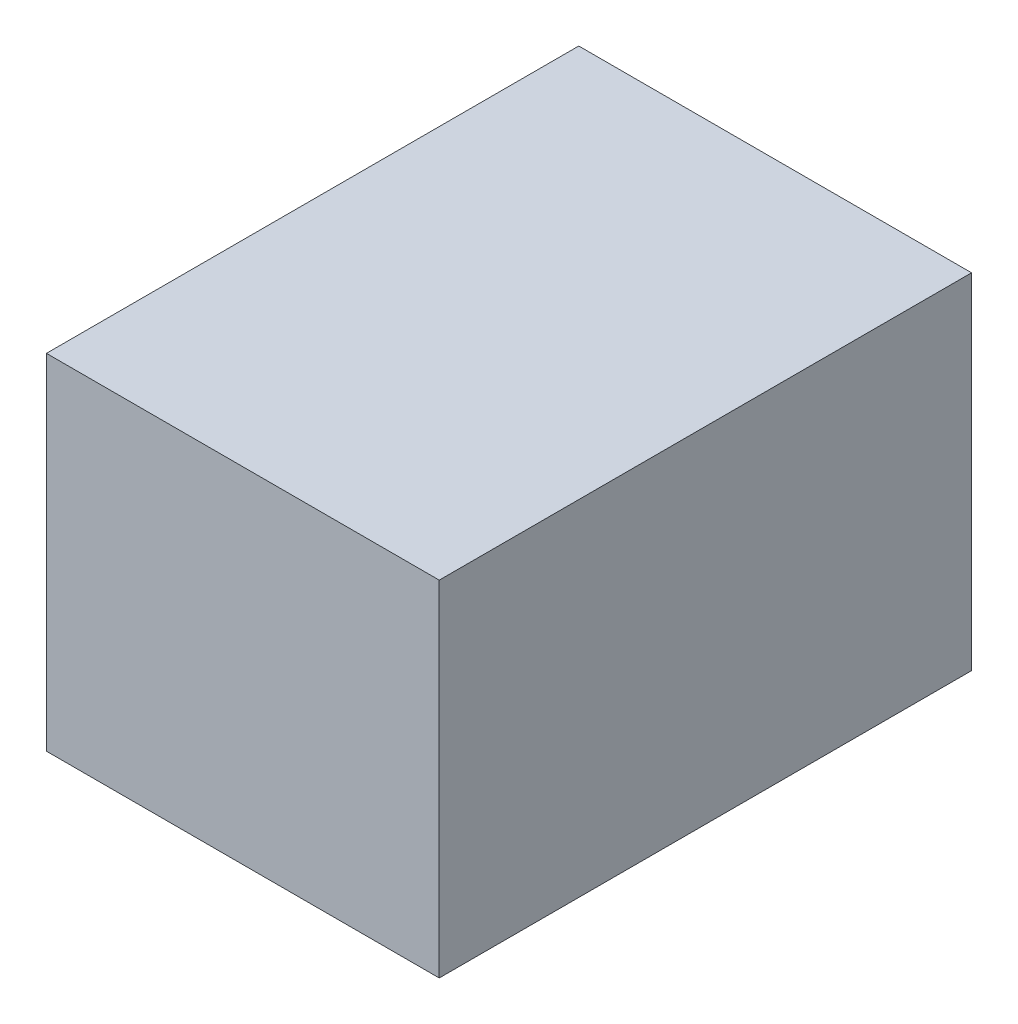
ISO-10303-21;
HEADER;
FILE_DESCRIPTION(('STEP AP214'),'2;1');
FILE_NAME('part.step','',(''),(''),'','','');
FILE_SCHEMA(('AUTOMOTIVE_DESIGN { 1 0 10303 214 1 1 1 1 }'));
ENDSEC;
DATA;
#1=APPLICATION_CONTEXT('core data for automotive mechanical design processes');
#2=APPLICATION_PROTOCOL_DEFINITION('international standard','automotive_design',2000,#1);
#3=PRODUCT_CONTEXT('',#1,'mechanical');
#4=PRODUCT('Part','Part','',(#3));
#5=PRODUCT_RELATED_PRODUCT_CATEGORY('part','',(#4));
#6=PRODUCT_DEFINITION_FORMATION('','',#4);
#7=PRODUCT_DEFINITION_CONTEXT('part definition',#1,'design');
#8=PRODUCT_DEFINITION('design','',#6,#7);
#9=PRODUCT_DEFINITION_SHAPE('','',#8);
#10=(LENGTH_UNIT() NAMED_UNIT(*) SI_UNIT(.MILLI.,.METRE.));
#11=(NAMED_UNIT(*) PLANE_ANGLE_UNIT() SI_UNIT($,.RADIAN.));
#12=(NAMED_UNIT(*) SI_UNIT($,.STERADIAN.) SOLID_ANGLE_UNIT());
#13=UNCERTAINTY_MEASURE_WITH_UNIT(LENGTH_MEASURE(1.E-05),#10,'distance_accuracy_value','');
#14=(GEOMETRIC_REPRESENTATION_CONTEXT(3) GLOBAL_UNCERTAINTY_ASSIGNED_CONTEXT((#13)) GLOBAL_UNIT_ASSIGNED_CONTEXT((#10,
#11,#12)) REPRESENTATION_CONTEXT('',''));
#15=CARTESIAN_POINT('',(0.,0.,0.));
#16=DIRECTION('',(0.,0.,1.));
#17=DIRECTION('',(1.,0.,0.));
#18=AXIS2_PLACEMENT_3D('',#15,#16,#17);
#19=CARTESIAN_POINT('',(0.7239,0.635,0.));
#20=DIRECTION('',(0.,1.,0.));
#21=DIRECTION('',(-1.,0.,0.));
#22=AXIS2_PLACEMENT_3D('',#19,#20,#21);
#23=PLANE('',#22);
#24=DIRECTION('',(1.,0.,0.));
#25=VECTOR('',#24,1.);
#26=CARTESIAN_POINT('',(0.,0.635,1.962));
#27=LINE('',#26,#25);
#28=CARTESIAN_POINT('',(0.7239,0.635,1.962));
#29=VERTEX_POINT('',#28);
#30=CARTESIAN_POINT('',(-0.723900000000001,0.635000000000001,1.962));
#31=VERTEX_POINT('',#30);
#32=EDGE_CURVE('E68',#29,#31,#27,.F.);
#33=ORIENTED_EDGE('',*,*,#32,.F.);
#34=DIRECTION('',(0.,0.,-1.));
#35=VECTOR('',#34,1.);
#36=CARTESIAN_POINT('',(0.7239,0.635,0.));
#37=LINE('',#36,#35);
#38=CARTESIAN_POINT('',(0.7239,0.635,0.));
#39=VERTEX_POINT('',#38);
#40=EDGE_CURVE('E55',#39,#29,#37,.F.);
#41=ORIENTED_EDGE('',*,*,#40,.F.);
#42=DIRECTION('',(1.,0.,0.));
#43=VECTOR('',#42,1.);
#44=CARTESIAN_POINT('',(0.,0.635,0.));
#45=LINE('',#44,#43);
#46=CARTESIAN_POINT('',(-0.7239,0.635,0.));
#47=VERTEX_POINT('',#46);
#48=EDGE_CURVE('E20',#39,#47,#45,.F.);
#49=ORIENTED_EDGE('',*,*,#48,.T.);
#50=DIRECTION('',(0.,0.,1.));
#51=VECTOR('',#50,1.);
#52=CARTESIAN_POINT('',(-0.7239,0.635000000000001,0.));
#53=LINE('',#52,#51);
#54=EDGE_CURVE('E81',#31,#47,#53,.F.);
#55=ORIENTED_EDGE('',*,*,#54,.F.);
#56=EDGE_LOOP('',(#33,#41,#49,#55));
#57=FACE_BOUND('',#56,.T.);
#58=ADVANCED_FACE('F17',(#57),#23,.T.);
#59=CARTESIAN_POINT('',(0.,0.,0.));
#60=DIRECTION('',(0.,0.,1.));
#61=DIRECTION('',(1.,0.,0.));
#62=AXIS2_PLACEMENT_3D('',#59,#60,#61);
#63=PLANE('',#62);
#64=DIRECTION('',(0.,1.,0.));
#65=VECTOR('',#64,1.);
#66=CARTESIAN_POINT('',(-0.7239,0.635,0.));
#67=LINE('',#66,#65);
#68=CARTESIAN_POINT('',(-0.7239,-0.635,0.));
#69=VERTEX_POINT('',#68);
#70=EDGE_CURVE('E64',#47,#69,#67,.F.);
#71=ORIENTED_EDGE('',*,*,#70,.F.);
#72=ORIENTED_EDGE('',*,*,#48,.F.);
#73=DIRECTION('',(0.,1.,0.));
#74=VECTOR('',#73,1.);
#75=CARTESIAN_POINT('',(0.7239,-0.635,0.));
#76=LINE('',#75,#74);
#77=CARTESIAN_POINT('',(0.7239,-0.635,0.));
#78=VERTEX_POINT('',#77);
#79=EDGE_CURVE('E61',#78,#39,#76,.T.);
#80=ORIENTED_EDGE('',*,*,#79,.F.);
#81=DIRECTION('',(1.,0.,0.));
#82=VECTOR('',#81,1.);
#83=CARTESIAN_POINT('',(-0.7239,-0.635,0.));
#84=LINE('',#83,#82);
#85=EDGE_CURVE('E83',#69,#78,#84,.T.);
#86=ORIENTED_EDGE('',*,*,#85,.F.);
#87=EDGE_LOOP('',(#71,#72,#80,#86));
#88=FACE_BOUND('',#87,.T.);
#89=ADVANCED_FACE('F60',(#88),#63,.F.);
#90=CARTESIAN_POINT('',(0.7239,-0.635,0.));
#91=DIRECTION('',(1.,0.,0.));
#92=DIRECTION('',(0.,0.,-1.));
#93=AXIS2_PLACEMENT_3D('',#90,#91,#92);
#94=PLANE('',#93);
#95=DIRECTION('',(0.,1.,0.));
#96=VECTOR('',#95,1.);
#97=CARTESIAN_POINT('',(0.7239,0.,1.962));
#98=LINE('',#97,#96);
#99=CARTESIAN_POINT('',(0.7239,-0.635,1.962));
#100=VERTEX_POINT('',#99);
#101=EDGE_CURVE('E70',#100,#29,#98,.T.);
#102=ORIENTED_EDGE('',*,*,#101,.F.);
#103=DIRECTION('',(0.,0.,-1.));
#104=VECTOR('',#103,1.);
#105=CARTESIAN_POINT('',(0.7239,-0.635,0.));
#106=LINE('',#105,#104);
#107=EDGE_CURVE('E74',#78,#100,#106,.F.);
#108=ORIENTED_EDGE('',*,*,#107,.F.);
#109=ORIENTED_EDGE('',*,*,#79,.T.);
#110=ORIENTED_EDGE('',*,*,#40,.T.);
#111=EDGE_LOOP('',(#102,#108,#109,#110));
#112=FACE_BOUND('',#111,.T.);
#113=ADVANCED_FACE('F72',(#112),#94,.T.);
#114=CARTESIAN_POINT('',(0.,0.,1.962));
#115=DIRECTION('',(0.,0.,1.));
#116=DIRECTION('',(1.,0.,0.));
#117=AXIS2_PLACEMENT_3D('',#114,#115,#116);
#118=PLANE('',#117);
#119=ORIENTED_EDGE('',*,*,#32,.T.);
#120=DIRECTION('',(0.,1.,0.));
#121=VECTOR('',#120,1.);
#122=CARTESIAN_POINT('',(-0.7239,0.635,1.962));
#123=LINE('',#122,#121);
#124=CARTESIAN_POINT('',(-0.723900000000001,-0.634999999999999,1.962));
#125=VERTEX_POINT('',#124);
#126=EDGE_CURVE('E35',#125,#31,#123,.T.);
#127=ORIENTED_EDGE('',*,*,#126,.F.);
#128=DIRECTION('',(1.,0.,0.));
#129=VECTOR('',#128,1.);
#130=CARTESIAN_POINT('',(-0.7239,-0.635,1.962));
#131=LINE('',#130,#129);
#132=EDGE_CURVE('E26',#100,#125,#131,.F.);
#133=ORIENTED_EDGE('',*,*,#132,.F.);
#134=ORIENTED_EDGE('',*,*,#101,.T.);
#135=EDGE_LOOP('',(#119,#127,#133,#134));
#136=FACE_BOUND('',#135,.T.);
#137=ADVANCED_FACE('F89',(#136),#118,.T.);
#138=CARTESIAN_POINT('',(-0.7239,0.635,0.));
#139=DIRECTION('',(-1.,0.,0.));
#140=DIRECTION('',(0.,0.,1.));
#141=AXIS2_PLACEMENT_3D('',#138,#139,#140);
#142=PLANE('',#141);
#143=ORIENTED_EDGE('',*,*,#126,.T.);
#144=ORIENTED_EDGE('',*,*,#54,.T.);
#145=ORIENTED_EDGE('',*,*,#70,.T.);
#146=DIRECTION('',(0.,0.,-1.));
#147=VECTOR('',#146,1.);
#148=CARTESIAN_POINT('',(-0.723900000000001,-0.635,0.));
#149=LINE('',#148,#147);
#150=EDGE_CURVE('E11',#125,#69,#149,.T.);
#151=ORIENTED_EDGE('',*,*,#150,.F.);
#152=EDGE_LOOP('',(#143,#144,#145,#151));
#153=FACE_BOUND('',#152,.T.);
#154=ADVANCED_FACE('F91',(#153),#142,.T.);
#155=CARTESIAN_POINT('',(-0.7239,-0.635,0.));
#156=DIRECTION('',(0.,-1.,0.));
#157=DIRECTION('',(0.,0.,-1.));
#158=AXIS2_PLACEMENT_3D('',#155,#156,#157);
#159=PLANE('',#158);
#160=ORIENTED_EDGE('',*,*,#132,.T.);
#161=ORIENTED_EDGE('',*,*,#150,.T.);
#162=ORIENTED_EDGE('',*,*,#85,.T.);
#163=ORIENTED_EDGE('',*,*,#107,.T.);
#164=EDGE_LOOP('',(#160,#161,#162,#163));
#165=FACE_BOUND('',#164,.T.);
#166=ADVANCED_FACE('F88',(#165),#159,.T.);
#167=CLOSED_SHELL('',(#58,#89,#113,#137,#154,#166));
#168=MANIFOLD_SOLID_BREP('B1',#167);
#169=ADVANCED_BREP_SHAPE_REPRESENTATION('',(#18,#168),#14);
#170=SHAPE_DEFINITION_REPRESENTATION(#9,#169);
ENDSEC;
END-ISO-10303-21;
